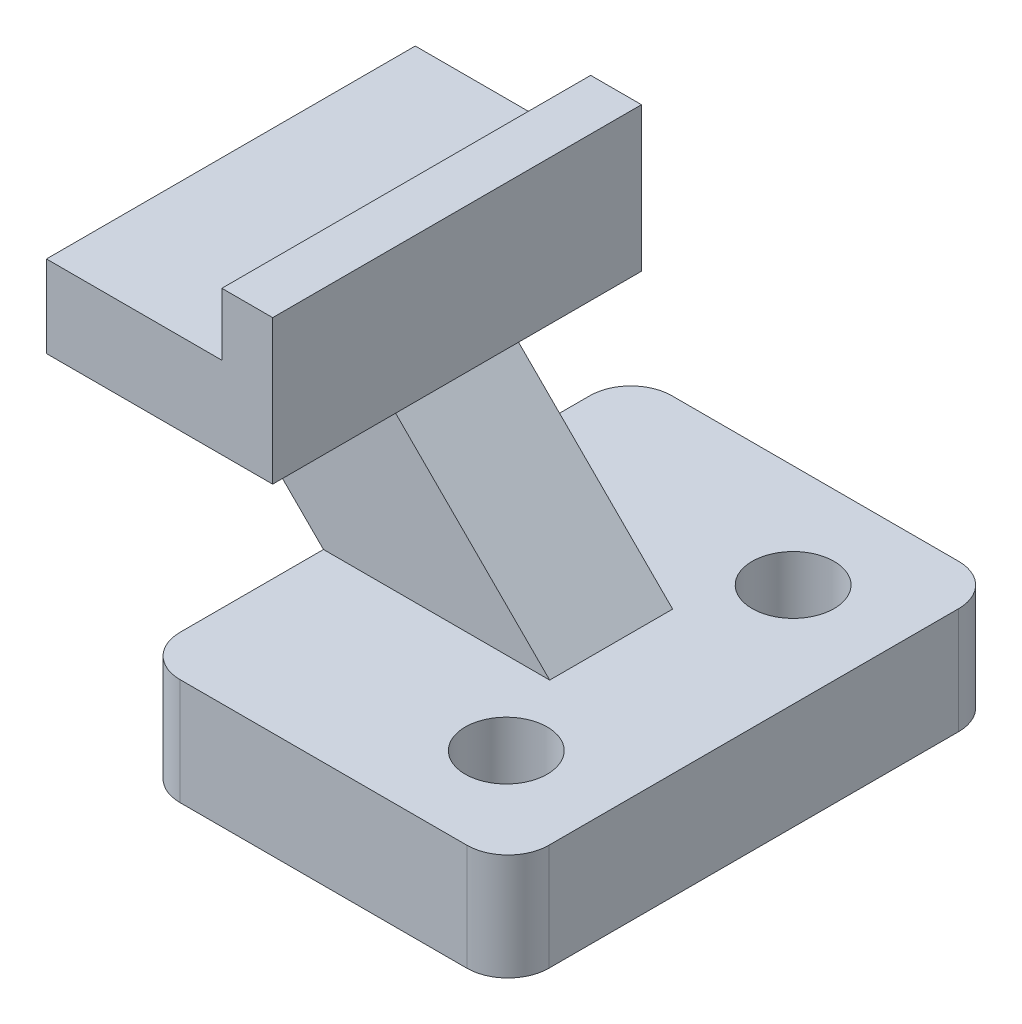
ISO-10303-21;
HEADER;
FILE_DESCRIPTION(('STEP AP214'),'2;1');
FILE_NAME('part.step','',(''),(''),'','','');
FILE_SCHEMA(('AUTOMOTIVE_DESIGN { 1 0 10303 214 1 1 1 1 }'));
ENDSEC;
DATA;
#1=APPLICATION_CONTEXT('core data for automotive mechanical design processes');
#2=APPLICATION_PROTOCOL_DEFINITION('international standard','automotive_design',2000,#1);
#3=PRODUCT_CONTEXT('',#1,'mechanical');
#4=PRODUCT('Part','Part','',(#3));
#5=PRODUCT_RELATED_PRODUCT_CATEGORY('part','',(#4));
#6=PRODUCT_DEFINITION_FORMATION('','',#4);
#7=PRODUCT_DEFINITION_CONTEXT('part definition',#1,'design');
#8=PRODUCT_DEFINITION('design','',#6,#7);
#9=PRODUCT_DEFINITION_SHAPE('','',#8);
#10=(LENGTH_UNIT() NAMED_UNIT(*) SI_UNIT(.MILLI.,.METRE.));
#11=(NAMED_UNIT(*) PLANE_ANGLE_UNIT() SI_UNIT($,.RADIAN.));
#12=(NAMED_UNIT(*) SI_UNIT($,.STERADIAN.) SOLID_ANGLE_UNIT());
#13=UNCERTAINTY_MEASURE_WITH_UNIT(LENGTH_MEASURE(1.E-05),#10,'distance_accuracy_value','');
#14=(GEOMETRIC_REPRESENTATION_CONTEXT(3) GLOBAL_UNCERTAINTY_ASSIGNED_CONTEXT((#13)) GLOBAL_UNIT_ASSIGNED_CONTEXT((#10,
#11,#12)) REPRESENTATION_CONTEXT('',''));
#15=CARTESIAN_POINT('',(0.,0.,0.));
#16=DIRECTION('',(0.,0.,1.));
#17=DIRECTION('',(1.,0.,0.));
#18=AXIS2_PLACEMENT_3D('',#15,#16,#17);
#19=CARTESIAN_POINT('',(0.,0.,0.375));
#20=DIRECTION('',(0.,0.,1.));
#21=DIRECTION('',(1.,0.,0.));
#22=AXIS2_PLACEMENT_3D('',#19,#20,#21);
#23=PLANE('',#22);
#24=DIRECTION('',(-0.707106781186551,0.707106781186543,0.));
#25=VECTOR('',#24,1.);
#26=CARTESIAN_POINT('',(-0.685000000000011,1.59,0.375));
#27=LINE('',#26,#25);
#28=CARTESIAN_POINT('',(0.254999999999999,0.65,0.375));
#29=VERTEX_POINT('',#28);
#30=CARTESIAN_POINT('',(-0.685000000000011,1.59,0.375));
#31=VERTEX_POINT('',#30);
#32=EDGE_CURVE('E200',#29,#31,#27,.T.);
#33=ORIENTED_EDGE('',*,*,#32,.T.);
#34=DIRECTION('',(-1.,0.,0.));
#35=VECTOR('',#34,1.);
#36=CARTESIAN_POINT('',(0.,1.59,0.375));
#37=LINE('',#36,#35);
#38=CARTESIAN_POINT('',(-2.06500000000001,1.59,0.375));
#39=VERTEX_POINT('',#38);
#40=EDGE_CURVE('E192',#31,#39,#37,.T.);
#41=ORIENTED_EDGE('',*,*,#40,.T.);
#42=DIRECTION('',(0.707106781186551,-0.707106781186544,0.));
#43=VECTOR('',#42,1.);
#44=CARTESIAN_POINT('',(-1.125,0.65,0.375));
#45=LINE('',#44,#43);
#46=CARTESIAN_POINT('',(-1.125,0.65,0.375));
#47=VERTEX_POINT('',#46);
#48=EDGE_CURVE('E203',#39,#47,#45,.T.);
#49=ORIENTED_EDGE('',*,*,#48,.T.);
#50=DIRECTION('',(1.,0.,0.));
#51=VECTOR('',#50,1.);
#52=CARTESIAN_POINT('',(-1.125,0.65,0.375));
#53=LINE('',#52,#51);
#54=EDGE_CURVE('E60',#47,#29,#53,.T.);
#55=ORIENTED_EDGE('',*,*,#54,.T.);
#56=EDGE_LOOP('',(#33,#41,#49,#55));
#57=FACE_BOUND('',#56,.T.);
#58=ADVANCED_FACE('F39',(#57),#23,.T.);
#59=CARTESIAN_POINT('',(0.,0.,-0.375));
#60=DIRECTION('',(0.,0.,1.));
#61=DIRECTION('',(1.,0.,0.));
#62=AXIS2_PLACEMENT_3D('',#59,#60,#61);
#63=PLANE('',#62);
#64=DIRECTION('',(-1.,0.,0.));
#65=VECTOR('',#64,1.);
#66=CARTESIAN_POINT('',(0.,1.59,-0.375));
#67=LINE('',#66,#65);
#68=CARTESIAN_POINT('',(-0.685000000000011,1.59,-0.375));
#69=VERTEX_POINT('',#68);
#70=CARTESIAN_POINT('',(-2.06500000000001,1.59,-0.375));
#71=VERTEX_POINT('',#70);
#72=EDGE_CURVE('E11',#69,#71,#67,.T.);
#73=ORIENTED_EDGE('',*,*,#72,.F.);
#74=DIRECTION('',(-0.707106781186551,0.707106781186543,0.));
#75=VECTOR('',#74,1.);
#76=CARTESIAN_POINT('',(-0.685000000000011,1.59,-0.375));
#77=LINE('',#76,#75);
#78=CARTESIAN_POINT('',(0.254999999999999,0.65,-0.375));
#79=VERTEX_POINT('',#78);
#80=EDGE_CURVE('E208',#79,#69,#77,.T.);
#81=ORIENTED_EDGE('',*,*,#80,.F.);
#82=DIRECTION('',(1.,0.,0.));
#83=VECTOR('',#82,1.);
#84=CARTESIAN_POINT('',(-1.125,0.65,-0.375));
#85=LINE('',#84,#83);
#86=CARTESIAN_POINT('',(-1.125,0.65,-0.375));
#87=VERTEX_POINT('',#86);
#88=EDGE_CURVE('E54',#87,#79,#85,.T.);
#89=ORIENTED_EDGE('',*,*,#88,.F.);
#90=DIRECTION('',(0.707106781186551,-0.707106781186544,0.));
#91=VECTOR('',#90,1.);
#92=CARTESIAN_POINT('',(-1.125,0.65,-0.375));
#93=LINE('',#92,#91);
#94=EDGE_CURVE('E201',#71,#87,#93,.T.);
#95=ORIENTED_EDGE('',*,*,#94,.F.);
#96=EDGE_LOOP('',(#73,#81,#89,#95));
#97=FACE_BOUND('',#96,.T.);
#98=ADVANCED_FACE('F347',(#97),#63,.F.);
#99=CARTESIAN_POINT('',(-0.875,0.65,1.25));
#100=DIRECTION('',(0.,1.,0.));
#101=DIRECTION('',(0.,0.,1.));
#102=AXIS2_PLACEMENT_3D('',#99,#100,#101);
#103=PLANE('',#102);
#104=CARTESIAN_POINT('',(0.495,0.65,-0.87));
#105=DIRECTION('',(0.,1.,0.));
#106=DIRECTION('',(0.,0.,1.));
#107=AXIS2_PLACEMENT_3D('',#104,#105,#106);
#108=CIRCLE('',#107,0.25);
#109=CARTESIAN_POINT('',(0.495,0.65,-0.62));
#110=VERTEX_POINT('',#109);
#111=EDGE_CURVE('E236',#110,#110,#108,.T.);
#112=ORIENTED_EDGE('',*,*,#111,.F.);
#113=EDGE_LOOP('',(#112));
#114=FACE_BOUND('',#113,.T.);
#115=CARTESIAN_POINT('',(0.495,0.65,0.88));
#116=DIRECTION('',(0.,1.,0.));
#117=DIRECTION('',(0.,0.,1.));
#118=AXIS2_PLACEMENT_3D('',#115,#116,#117);
#119=CIRCLE('',#118,0.25);
#120=CARTESIAN_POINT('',(0.495,0.65,1.13));
#121=VERTEX_POINT('',#120);
#122=EDGE_CURVE('E230',#121,#121,#119,.T.);
#123=ORIENTED_EDGE('',*,*,#122,.F.);
#124=EDGE_LOOP('',(#123));
#125=FACE_BOUND('',#124,.T.);
#126=DIRECTION('',(0.,0.,1.));
#127=VECTOR('',#126,1.);
#128=CARTESIAN_POINT('',(-1.125,0.65,-1.25));
#129=LINE('',#128,#127);
#130=CARTESIAN_POINT('',(-1.125,0.65,-1.25));
#131=VERTEX_POINT('',#130);
#132=EDGE_CURVE('E259',#131,#87,#129,.T.);
#133=ORIENTED_EDGE('',*,*,#132,.T.);
#134=ORIENTED_EDGE('',*,*,#88,.T.);
#135=DIRECTION('',(0.,0.,-1.));
#136=VECTOR('',#135,1.);
#137=CARTESIAN_POINT('',(0.254999999999999,0.65,0.375));
#138=LINE('',#137,#136);
#139=EDGE_CURVE('E226',#29,#79,#138,.T.);
#140=ORIENTED_EDGE('',*,*,#139,.F.);
#141=ORIENTED_EDGE('',*,*,#54,.F.);
#142=CARTESIAN_POINT('',(-1.125,0.65,1.25));
#143=VERTEX_POINT('',#142);
#144=EDGE_CURVE('E258',#47,#143,#129,.T.);
#145=ORIENTED_EDGE('',*,*,#144,.T.);
#146=CARTESIAN_POINT('',(-0.875,0.65,1.25));
#147=DIRECTION('',(0.,1.,0.));
#148=DIRECTION('',(0.,0.,1.));
#149=AXIS2_PLACEMENT_3D('',#146,#147,#148);
#150=CIRCLE('',#149,0.25);
#151=CARTESIAN_POINT('',(-0.875,0.65,1.5));
#152=VERTEX_POINT('',#151);
#153=EDGE_CURVE('E242',#143,#152,#150,.T.);
#154=ORIENTED_EDGE('',*,*,#153,.T.);
#155=DIRECTION('',(1.,0.,0.));
#156=VECTOR('',#155,1.);
#157=CARTESIAN_POINT('',(-0.875,0.65,1.5));
#158=LINE('',#157,#156);
#159=CARTESIAN_POINT('',(0.875,0.65,1.5));
#160=VERTEX_POINT('',#159);
#161=EDGE_CURVE('E245',#152,#160,#158,.T.);
#162=ORIENTED_EDGE('',*,*,#161,.T.);
#163=CARTESIAN_POINT('',(0.875,0.65,1.25));
#164=DIRECTION('',(0.,1.,0.));
#165=DIRECTION('',(0.,0.,1.));
#166=AXIS2_PLACEMENT_3D('',#163,#164,#165);
#167=CIRCLE('',#166,0.25);
#168=CARTESIAN_POINT('',(1.125,0.65,1.25));
#169=VERTEX_POINT('',#168);
#170=EDGE_CURVE('E248',#160,#169,#167,.T.);
#171=ORIENTED_EDGE('',*,*,#170,.T.);
#172=DIRECTION('',(0.,0.,-1.));
#173=VECTOR('',#172,1.);
#174=CARTESIAN_POINT('',(1.125,0.65,-1.25));
#175=LINE('',#174,#173);
#176=CARTESIAN_POINT('',(1.125,0.65,-1.25));
#177=VERTEX_POINT('',#176);
#178=EDGE_CURVE('E250',#169,#177,#175,.T.);
#179=ORIENTED_EDGE('',*,*,#178,.T.);
#180=CARTESIAN_POINT('',(0.875,0.65,-1.25));
#181=DIRECTION('',(0.,1.,0.));
#182=DIRECTION('',(0.,0.,1.));
#183=AXIS2_PLACEMENT_3D('',#180,#181,#182);
#184=CIRCLE('',#183,0.25);
#185=CARTESIAN_POINT('',(0.875,0.65,-1.5));
#186=VERTEX_POINT('',#185);
#187=EDGE_CURVE('E252',#177,#186,#184,.T.);
#188=ORIENTED_EDGE('',*,*,#187,.T.);
#189=DIRECTION('',(-1.,0.,0.));
#190=VECTOR('',#189,1.);
#191=CARTESIAN_POINT('',(-0.875,0.65,-1.5));
#192=LINE('',#191,#190);
#193=CARTESIAN_POINT('',(-0.875,0.65,-1.5));
#194=VERTEX_POINT('',#193);
#195=EDGE_CURVE('E254',#186,#194,#192,.T.);
#196=ORIENTED_EDGE('',*,*,#195,.T.);
#197=CARTESIAN_POINT('',(-0.875,0.65,-1.25));
#198=DIRECTION('',(0.,1.,0.));
#199=DIRECTION('',(0.,0.,1.));
#200=AXIS2_PLACEMENT_3D('',#197,#198,#199);
#201=CIRCLE('',#200,0.25);
#202=EDGE_CURVE('E256',#194,#131,#201,.T.);
#203=ORIENTED_EDGE('',*,*,#202,.T.);
#204=EDGE_LOOP('',(#133,#134,#140,#141,#145,#154,#162,#171,#179,#188,#196,#203));
#205=FACE_BOUND('',#204,.T.);
#206=ADVANCED_FACE('F322',(#114,#125,#205),#103,.T.);
#207=CARTESIAN_POINT('',(-0.875,0.,1.25));
#208=DIRECTION('',(0.,1.,0.));
#209=DIRECTION('',(0.,0.,1.));
#210=AXIS2_PLACEMENT_3D('',#207,#208,#209);
#211=PLANE('',#210);
#212=CARTESIAN_POINT('',(-0.875,0.,1.25));
#213=DIRECTION('',(0.,1.,0.));
#214=DIRECTION('',(0.,0.,1.));
#215=AXIS2_PLACEMENT_3D('',#212,#213,#214);
#216=CIRCLE('',#215,0.25);
#217=CARTESIAN_POINT('',(-1.125,0.,1.25));
#218=VERTEX_POINT('',#217);
#219=CARTESIAN_POINT('',(-0.875,0.,1.5));
#220=VERTEX_POINT('',#219);
#221=EDGE_CURVE('E239',#218,#220,#216,.T.);
#222=ORIENTED_EDGE('',*,*,#221,.F.);
#223=DIRECTION('',(0.,0.,1.));
#224=VECTOR('',#223,1.);
#225=CARTESIAN_POINT('',(-1.125,0.,-1.25));
#226=LINE('',#225,#224);
#227=CARTESIAN_POINT('',(-1.125,0.,-1.25));
#228=VERTEX_POINT('',#227);
#229=EDGE_CURVE('E246',#228,#218,#226,.T.);
#230=ORIENTED_EDGE('',*,*,#229,.F.);
#231=CARTESIAN_POINT('',(-0.875,0.,-1.25));
#232=DIRECTION('',(0.,1.,0.));
#233=DIRECTION('',(0.,0.,1.));
#234=AXIS2_PLACEMENT_3D('',#231,#232,#233);
#235=CIRCLE('',#234,0.25);
#236=CARTESIAN_POINT('',(-0.875,0.,-1.5));
#237=VERTEX_POINT('',#236);
#238=EDGE_CURVE('E274',#237,#228,#235,.T.);
#239=ORIENTED_EDGE('',*,*,#238,.F.);
#240=DIRECTION('',(-1.,0.,0.));
#241=VECTOR('',#240,1.);
#242=CARTESIAN_POINT('',(-0.875,0.,-1.5));
#243=LINE('',#242,#241);
#244=CARTESIAN_POINT('',(0.875,0.,-1.5));
#245=VERTEX_POINT('',#244);
#246=EDGE_CURVE('E272',#245,#237,#243,.T.);
#247=ORIENTED_EDGE('',*,*,#246,.F.);
#248=CARTESIAN_POINT('',(0.875,0.,-1.25));
#249=DIRECTION('',(0.,1.,0.));
#250=DIRECTION('',(0.,0.,1.));
#251=AXIS2_PLACEMENT_3D('',#248,#249,#250);
#252=CIRCLE('',#251,0.25);
#253=CARTESIAN_POINT('',(1.125,0.,-1.25));
#254=VERTEX_POINT('',#253);
#255=EDGE_CURVE('E270',#254,#245,#252,.T.);
#256=ORIENTED_EDGE('',*,*,#255,.F.);
#257=DIRECTION('',(0.,0.,-1.));
#258=VECTOR('',#257,1.);
#259=CARTESIAN_POINT('',(1.125,0.,-1.25));
#260=LINE('',#259,#258);
#261=CARTESIAN_POINT('',(1.125,0.,1.25));
#262=VERTEX_POINT('',#261);
#263=EDGE_CURVE('E268',#262,#254,#260,.T.);
#264=ORIENTED_EDGE('',*,*,#263,.F.);
#265=CARTESIAN_POINT('',(0.875,0.,1.25));
#266=DIRECTION('',(0.,1.,0.));
#267=DIRECTION('',(0.,0.,1.));
#268=AXIS2_PLACEMENT_3D('',#265,#266,#267);
#269=CIRCLE('',#268,0.25);
#270=CARTESIAN_POINT('',(0.875,0.,1.5));
#271=VERTEX_POINT('',#270);
#272=EDGE_CURVE('E266',#271,#262,#269,.T.);
#273=ORIENTED_EDGE('',*,*,#272,.F.);
#274=DIRECTION('',(1.,0.,0.));
#275=VECTOR('',#274,1.);
#276=CARTESIAN_POINT('',(-0.875,0.,1.5));
#277=LINE('',#276,#275);
#278=EDGE_CURVE('E264',#220,#271,#277,.T.);
#279=ORIENTED_EDGE('',*,*,#278,.F.);
#280=EDGE_LOOP('',(#222,#230,#239,#247,#256,#264,#273,#279));
#281=FACE_BOUND('',#280,.T.);
#282=CARTESIAN_POINT('',(0.495,0.,-0.87));
#283=DIRECTION('',(0.,1.,0.));
#284=DIRECTION('',(0.,0.,1.));
#285=AXIS2_PLACEMENT_3D('',#282,#283,#284);
#286=CIRCLE('',#285,0.25);
#287=CARTESIAN_POINT('',(0.495,0.,-0.62));
#288=VERTEX_POINT('',#287);
#289=EDGE_CURVE('E233',#288,#288,#286,.T.);
#290=ORIENTED_EDGE('',*,*,#289,.T.);
#291=EDGE_LOOP('',(#290));
#292=FACE_BOUND('',#291,.T.);
#293=CARTESIAN_POINT('',(0.495,0.,0.88));
#294=DIRECTION('',(0.,1.,0.));
#295=DIRECTION('',(0.,0.,1.));
#296=AXIS2_PLACEMENT_3D('',#293,#294,#295);
#297=CIRCLE('',#296,0.25);
#298=CARTESIAN_POINT('',(0.495,0.,1.13));
#299=VERTEX_POINT('',#298);
#300=EDGE_CURVE('E229',#299,#299,#297,.T.);
#301=ORIENTED_EDGE('',*,*,#300,.T.);
#302=EDGE_LOOP('',(#301));
#303=FACE_BOUND('',#302,.T.);
#304=ADVANCED_FACE('F307',(#281,#292,#303),#211,.F.);
#305=CARTESIAN_POINT('',(-0.875,0.65,1.25));
#306=DIRECTION('',(0.,-1.,0.));
#307=DIRECTION('',(0.,0.,-1.));
#308=AXIS2_PLACEMENT_3D('',#305,#306,#307);
#309=CYLINDRICAL_SURFACE('',#308,0.25);
#310=ORIENTED_EDGE('',*,*,#221,.T.);
#311=DIRECTION('',(0.,-1.,0.));
#312=VECTOR('',#311,1.);
#313=CARTESIAN_POINT('',(-0.875,0.65,1.5));
#314=LINE('',#313,#312);
#315=EDGE_CURVE('E47',#152,#220,#314,.T.);
#316=ORIENTED_EDGE('',*,*,#315,.F.);
#317=ORIENTED_EDGE('',*,*,#153,.F.);
#318=DIRECTION('',(0.,-1.,0.));
#319=VECTOR('',#318,1.);
#320=CARTESIAN_POINT('',(-1.125,0.65,1.25));
#321=LINE('',#320,#319);
#322=EDGE_CURVE('E261',#143,#218,#321,.T.);
#323=ORIENTED_EDGE('',*,*,#322,.T.);
#324=EDGE_LOOP('',(#310,#316,#317,#323));
#325=FACE_BOUND('',#324,.T.);
#326=ADVANCED_FACE('F41',(#325),#309,.T.);
#327=CARTESIAN_POINT('',(-0.875,0.65,1.5));
#328=DIRECTION('',(0.,0.,-1.));
#329=DIRECTION('',(-1.,0.,0.));
#330=AXIS2_PLACEMENT_3D('',#327,#328,#329);
#331=PLANE('',#330);
#332=ORIENTED_EDGE('',*,*,#278,.T.);
#333=DIRECTION('',(0.,-1.,0.));
#334=VECTOR('',#333,1.);
#335=CARTESIAN_POINT('',(0.875,0.65,1.5));
#336=LINE('',#335,#334);
#337=EDGE_CURVE('E294',#160,#271,#336,.T.);
#338=ORIENTED_EDGE('',*,*,#337,.F.);
#339=ORIENTED_EDGE('',*,*,#161,.F.);
#340=ORIENTED_EDGE('',*,*,#315,.T.);
#341=EDGE_LOOP('',(#332,#338,#339,#340));
#342=FACE_BOUND('',#341,.T.);
#343=ADVANCED_FACE('F299',(#342),#331,.F.);
#344=CARTESIAN_POINT('',(0.875,0.65,1.25));
#345=DIRECTION('',(0.,-1.,0.));
#346=DIRECTION('',(0.,0.,-1.));
#347=AXIS2_PLACEMENT_3D('',#344,#345,#346);
#348=CYLINDRICAL_SURFACE('',#347,0.25);
#349=ORIENTED_EDGE('',*,*,#272,.T.);
#350=DIRECTION('',(0.,-1.,0.));
#351=VECTOR('',#350,1.);
#352=CARTESIAN_POINT('',(1.125,0.65,1.25));
#353=LINE('',#352,#351);
#354=EDGE_CURVE('E291',#169,#262,#353,.T.);
#355=ORIENTED_EDGE('',*,*,#354,.F.);
#356=ORIENTED_EDGE('',*,*,#170,.F.);
#357=ORIENTED_EDGE('',*,*,#337,.T.);
#358=EDGE_LOOP('',(#349,#355,#356,#357));
#359=FACE_BOUND('',#358,.T.);
#360=ADVANCED_FACE('F315',(#359),#348,.T.);
#361=CARTESIAN_POINT('',(1.125,0.65,-1.25));
#362=DIRECTION('',(-1.,0.,0.));
#363=DIRECTION('',(0.,0.,1.));
#364=AXIS2_PLACEMENT_3D('',#361,#362,#363);
#365=PLANE('',#364);
#366=ORIENTED_EDGE('',*,*,#263,.T.);
#367=DIRECTION('',(0.,-1.,0.));
#368=VECTOR('',#367,1.);
#369=CARTESIAN_POINT('',(1.125,0.65,-1.25));
#370=LINE('',#369,#368);
#371=EDGE_CURVE('E288',#177,#254,#370,.T.);
#372=ORIENTED_EDGE('',*,*,#371,.F.);
#373=ORIENTED_EDGE('',*,*,#178,.F.);
#374=ORIENTED_EDGE('',*,*,#354,.T.);
#375=EDGE_LOOP('',(#366,#372,#373,#374));
#376=FACE_BOUND('',#375,.T.);
#377=ADVANCED_FACE('F319',(#376),#365,.F.);
#378=CARTESIAN_POINT('',(0.875,0.65,-1.25));
#379=DIRECTION('',(0.,-1.,0.));
#380=DIRECTION('',(0.,0.,-1.));
#381=AXIS2_PLACEMENT_3D('',#378,#379,#380);
#382=CYLINDRICAL_SURFACE('',#381,0.25);
#383=ORIENTED_EDGE('',*,*,#255,.T.);
#384=DIRECTION('',(0.,-1.,0.));
#385=VECTOR('',#384,1.);
#386=CARTESIAN_POINT('',(0.875,0.65,-1.5));
#387=LINE('',#386,#385);
#388=EDGE_CURVE('E285',#186,#245,#387,.T.);
#389=ORIENTED_EDGE('',*,*,#388,.F.);
#390=ORIENTED_EDGE('',*,*,#187,.F.);
#391=ORIENTED_EDGE('',*,*,#371,.T.);
#392=EDGE_LOOP('',(#383,#389,#390,#391));
#393=FACE_BOUND('',#392,.T.);
#394=ADVANCED_FACE('F337',(#393),#382,.T.);
#395=CARTESIAN_POINT('',(-0.875,0.65,-1.5));
#396=DIRECTION('',(0.,0.,1.));
#397=DIRECTION('',(1.,0.,0.));
#398=AXIS2_PLACEMENT_3D('',#395,#396,#397);
#399=PLANE('',#398);
#400=ORIENTED_EDGE('',*,*,#246,.T.);
#401=DIRECTION('',(0.,-1.,0.));
#402=VECTOR('',#401,1.);
#403=CARTESIAN_POINT('',(-0.875,0.65,-1.5));
#404=LINE('',#403,#402);
#405=EDGE_CURVE('E282',#194,#237,#404,.T.);
#406=ORIENTED_EDGE('',*,*,#405,.F.);
#407=ORIENTED_EDGE('',*,*,#195,.F.);
#408=ORIENTED_EDGE('',*,*,#388,.T.);
#409=EDGE_LOOP('',(#400,#406,#407,#408));
#410=FACE_BOUND('',#409,.T.);
#411=ADVANCED_FACE('F334',(#410),#399,.F.);
#412=CARTESIAN_POINT('',(-0.875,0.65,-1.25));
#413=DIRECTION('',(0.,-1.,0.));
#414=DIRECTION('',(0.,0.,-1.));
#415=AXIS2_PLACEMENT_3D('',#412,#413,#414);
#416=CYLINDRICAL_SURFACE('',#415,0.25);
#417=ORIENTED_EDGE('',*,*,#238,.T.);
#418=DIRECTION('',(0.,-1.,0.));
#419=VECTOR('',#418,1.);
#420=CARTESIAN_POINT('',(-1.125,0.65,-1.25));
#421=LINE('',#420,#419);
#422=EDGE_CURVE('E279',#131,#228,#421,.T.);
#423=ORIENTED_EDGE('',*,*,#422,.F.);
#424=ORIENTED_EDGE('',*,*,#202,.F.);
#425=ORIENTED_EDGE('',*,*,#405,.T.);
#426=EDGE_LOOP('',(#417,#423,#424,#425));
#427=FACE_BOUND('',#426,.T.);
#428=ADVANCED_FACE('F330',(#427),#416,.T.);
#429=CARTESIAN_POINT('',(-1.125,0.65,-1.25));
#430=DIRECTION('',(1.,0.,0.));
#431=DIRECTION('',(0.,0.,-1.));
#432=AXIS2_PLACEMENT_3D('',#429,#430,#431);
#433=PLANE('',#432);
#434=ORIENTED_EDGE('',*,*,#229,.T.);
#435=ORIENTED_EDGE('',*,*,#322,.F.);
#436=ORIENTED_EDGE('',*,*,#144,.F.);
#437=DIRECTION('',(0.,0.,-1.));
#438=VECTOR('',#437,1.);
#439=CARTESIAN_POINT('',(-1.125,0.65,0.375));
#440=LINE('',#439,#438);
#441=EDGE_CURVE('E206',#47,#87,#440,.T.);
#442=ORIENTED_EDGE('',*,*,#441,.T.);
#443=ORIENTED_EDGE('',*,*,#132,.F.);
#444=ORIENTED_EDGE('',*,*,#422,.T.);
#445=EDGE_LOOP('',(#434,#435,#436,#442,#443,#444));
#446=FACE_BOUND('',#445,.T.);
#447=ADVANCED_FACE('F325',(#446),#433,.F.);
#448=CARTESIAN_POINT('',(0.495,0.65,-0.87));
#449=DIRECTION('',(0.,-1.,0.));
#450=DIRECTION('',(0.,0.,-1.));
#451=AXIS2_PLACEMENT_3D('',#448,#449,#450);
#452=CYLINDRICAL_SURFACE('',#451,0.25);
#453=ORIENTED_EDGE('',*,*,#111,.T.);
#454=EDGE_LOOP('',(#453));
#455=FACE_BOUND('',#454,.T.);
#456=ORIENTED_EDGE('',*,*,#289,.F.);
#457=EDGE_LOOP('',(#456));
#458=FACE_BOUND('',#457,.T.);
#459=ADVANCED_FACE('F388',(#455,#458),#452,.F.);
#460=CARTESIAN_POINT('',(0.495,0.65,0.88));
#461=DIRECTION('',(0.,-1.,0.));
#462=DIRECTION('',(0.,0.,-1.));
#463=AXIS2_PLACEMENT_3D('',#460,#461,#462);
#464=CYLINDRICAL_SURFACE('',#463,0.25);
#465=ORIENTED_EDGE('',*,*,#122,.T.);
#466=EDGE_LOOP('',(#465));
#467=FACE_BOUND('',#466,.T.);
#468=ORIENTED_EDGE('',*,*,#300,.F.);
#469=EDGE_LOOP('',(#468));
#470=FACE_BOUND('',#469,.T.);
#471=ADVANCED_FACE('F384',(#467,#470),#464,.F.);
#472=CARTESIAN_POINT('',(-0.685000000000011,1.59,0.375));
#473=DIRECTION('',(-0.707106781186543,-0.707106781186552,0.));
#474=DIRECTION('',(0.707106781186552,-0.707106781186543,0.));
#475=AXIS2_PLACEMENT_3D('',#472,#473,#474);
#476=PLANE('',#475);
#477=ORIENTED_EDGE('',*,*,#80,.T.);
#478=DIRECTION('',(0.,0.,-1.));
#479=VECTOR('',#478,1.);
#480=CARTESIAN_POINT('',(-0.685000000000011,1.59,0.375));
#481=LINE('',#480,#479);
#482=EDGE_CURVE('E223',#31,#69,#481,.T.);
#483=ORIENTED_EDGE('',*,*,#482,.F.);
#484=ORIENTED_EDGE('',*,*,#32,.F.);
#485=ORIENTED_EDGE('',*,*,#139,.T.);
#486=EDGE_LOOP('',(#477,#483,#484,#485));
#487=FACE_BOUND('',#486,.T.);
#488=ADVANCED_FACE('F380',(#487),#476,.F.);
#489=CARTESIAN_POINT('',(-0.685000000000011,1.59,0.375));
#490=DIRECTION('',(-1.,0.,0.));
#491=DIRECTION('',(0.,0.,1.));
#492=AXIS2_PLACEMENT_3D('',#489,#490,#491);
#493=PLANE('',#492);
#494=ORIENTED_EDGE('',*,*,#482,.T.);
#495=DIRECTION('',(0.,0.,-1.));
#496=VECTOR('',#495,1.);
#497=CARTESIAN_POINT('',(-0.685000000000011,1.59,1.125));
#498=LINE('',#497,#496);
#499=CARTESIAN_POINT('',(-0.685000000000011,1.59,-1.125));
#500=VERTEX_POINT('',#499);
#501=EDGE_CURVE('E625',#69,#500,#498,.T.);
#502=ORIENTED_EDGE('',*,*,#501,.T.);
#503=DIRECTION('',(0.,1.,0.));
#504=VECTOR('',#503,1.);
#505=CARTESIAN_POINT('',(-0.685000000000011,1.59,-1.125));
#506=LINE('',#505,#504);
#507=CARTESIAN_POINT('',(-0.685000000000011,2.47,-1.125));
#508=VERTEX_POINT('',#507);
#509=EDGE_CURVE('E647',#500,#508,#506,.T.);
#510=ORIENTED_EDGE('',*,*,#509,.T.);
#511=DIRECTION('',(0.,0.,-1.));
#512=VECTOR('',#511,1.);
#513=CARTESIAN_POINT('',(-0.685000000000011,2.47,0.375));
#514=LINE('',#513,#512);
#515=CARTESIAN_POINT('',(-0.685000000000011,2.47,1.125));
#516=VERTEX_POINT('',#515);
#517=EDGE_CURVE('E221',#516,#508,#514,.T.);
#518=ORIENTED_EDGE('',*,*,#517,.F.);
#519=DIRECTION('',(0.,1.,0.));
#520=VECTOR('',#519,1.);
#521=CARTESIAN_POINT('',(-0.685000000000011,1.59,1.125));
#522=LINE('',#521,#520);
#523=CARTESIAN_POINT('',(-0.685000000000011,1.59,1.125));
#524=VERTEX_POINT('',#523);
#525=EDGE_CURVE('E174',#524,#516,#522,.T.);
#526=ORIENTED_EDGE('',*,*,#525,.F.);
#527=EDGE_CURVE('E170',#524,#31,#498,.T.);
#528=ORIENTED_EDGE('',*,*,#527,.T.);
#529=EDGE_LOOP('',(#494,#502,#510,#518,#526,#528));
#530=FACE_BOUND('',#529,.T.);
#531=ADVANCED_FACE('F376',(#530),#493,.F.);
#532=CARTESIAN_POINT('',(-0.685000000000011,2.47,0.375));
#533=DIRECTION('',(0.,-1.,0.));
#534=DIRECTION('',(0.,0.,-1.));
#535=AXIS2_PLACEMENT_3D('',#532,#533,#534);
#536=PLANE('',#535);
#537=ORIENTED_EDGE('',*,*,#517,.T.);
#538=DIRECTION('',(-1.,0.,0.));
#539=VECTOR('',#538,1.);
#540=CARTESIAN_POINT('',(-0.685000000000011,2.47,-1.125));
#541=LINE('',#540,#539);
#542=CARTESIAN_POINT('',(-0.995000000000011,2.47,-1.125));
#543=VERTEX_POINT('',#542);
#544=EDGE_CURVE('E649',#508,#543,#541,.T.);
#545=ORIENTED_EDGE('',*,*,#544,.T.);
#546=DIRECTION('',(0.,0.,-1.));
#547=VECTOR('',#546,1.);
#548=CARTESIAN_POINT('',(-0.995000000000011,2.47,0.375));
#549=LINE('',#548,#547);
#550=CARTESIAN_POINT('',(-0.995000000000011,2.47,1.125));
#551=VERTEX_POINT('',#550);
#552=EDGE_CURVE('E219',#551,#543,#549,.T.);
#553=ORIENTED_EDGE('',*,*,#552,.F.);
#554=DIRECTION('',(-1.,0.,0.));
#555=VECTOR('',#554,1.);
#556=CARTESIAN_POINT('',(-0.685000000000011,2.47,1.125));
#557=LINE('',#556,#555);
#558=EDGE_CURVE('E636',#516,#551,#557,.T.);
#559=ORIENTED_EDGE('',*,*,#558,.F.);
#560=EDGE_LOOP('',(#537,#545,#553,#559));
#561=FACE_BOUND('',#560,.T.);
#562=ADVANCED_FACE('F372',(#561),#536,.F.);
#563=CARTESIAN_POINT('',(-0.995000000000011,2.47,0.375));
#564=DIRECTION('',(1.,0.,0.));
#565=DIRECTION('',(0.,0.,-1.));
#566=AXIS2_PLACEMENT_3D('',#563,#564,#565);
#567=PLANE('',#566);
#568=ORIENTED_EDGE('',*,*,#552,.T.);
#569=DIRECTION('',(0.,-1.,0.));
#570=VECTOR('',#569,1.);
#571=CARTESIAN_POINT('',(-0.995000000000011,2.47,-1.125));
#572=LINE('',#571,#570);
#573=CARTESIAN_POINT('',(-0.995000000000011,2.09,-1.125));
#574=VERTEX_POINT('',#573);
#575=EDGE_CURVE('E652',#543,#574,#572,.T.);
#576=ORIENTED_EDGE('',*,*,#575,.T.);
#577=DIRECTION('',(0.,0.,-1.));
#578=VECTOR('',#577,1.);
#579=CARTESIAN_POINT('',(-0.995000000000011,2.09,0.375));
#580=LINE('',#579,#578);
#581=CARTESIAN_POINT('',(-0.995000000000011,2.09,1.125));
#582=VERTEX_POINT('',#581);
#583=EDGE_CURVE('E217',#582,#574,#580,.T.);
#584=ORIENTED_EDGE('',*,*,#583,.F.);
#585=DIRECTION('',(0.,-1.,0.));
#586=VECTOR('',#585,1.);
#587=CARTESIAN_POINT('',(-0.995000000000011,2.47,1.125));
#588=LINE('',#587,#586);
#589=EDGE_CURVE('E638',#551,#582,#588,.T.);
#590=ORIENTED_EDGE('',*,*,#589,.F.);
#591=EDGE_LOOP('',(#568,#576,#584,#590));
#592=FACE_BOUND('',#591,.T.);
#593=ADVANCED_FACE('F368',(#592),#567,.F.);
#594=CARTESIAN_POINT('',(-0.995000000000011,2.09,0.375));
#595=DIRECTION('',(0.,-1.,0.));
#596=DIRECTION('',(1.,0.,0.));
#597=AXIS2_PLACEMENT_3D('',#594,#595,#596);
#598=PLANE('',#597);
#599=ORIENTED_EDGE('',*,*,#583,.T.);
#600=DIRECTION('',(-1.,0.,0.));
#601=VECTOR('',#600,1.);
#602=CARTESIAN_POINT('',(-0.995000000000011,2.09,-1.125));
#603=LINE('',#602,#601);
#604=CARTESIAN_POINT('',(-2.06500000000001,2.09,-1.125));
#605=VERTEX_POINT('',#604);
#606=EDGE_CURVE('E184',#574,#605,#603,.T.);
#607=ORIENTED_EDGE('',*,*,#606,.T.);
#608=DIRECTION('',(0.,0.,-1.));
#609=VECTOR('',#608,1.);
#610=CARTESIAN_POINT('',(-2.06500000000001,2.09,0.375));
#611=LINE('',#610,#609);
#612=CARTESIAN_POINT('',(-2.06500000000001,2.09,1.125));
#613=VERTEX_POINT('',#612);
#614=EDGE_CURVE('E215',#613,#605,#611,.T.);
#615=ORIENTED_EDGE('',*,*,#614,.F.);
#616=DIRECTION('',(-1.,0.,0.));
#617=VECTOR('',#616,1.);
#618=CARTESIAN_POINT('',(-0.995000000000011,2.09,1.125));
#619=LINE('',#618,#617);
#620=EDGE_CURVE('E182',#582,#613,#619,.T.);
#621=ORIENTED_EDGE('',*,*,#620,.F.);
#622=EDGE_LOOP('',(#599,#607,#615,#621));
#623=FACE_BOUND('',#622,.T.);
#624=ADVANCED_FACE('F365',(#623),#598,.F.);
#625=CARTESIAN_POINT('',(-2.06500000000001,2.09,0.375));
#626=DIRECTION('',(1.,0.,0.));
#627=DIRECTION('',(0.,1.,0.));
#628=AXIS2_PLACEMENT_3D('',#625,#626,#627);
#629=PLANE('',#628);
#630=ORIENTED_EDGE('',*,*,#614,.T.);
#631=DIRECTION('',(0.,-1.,0.));
#632=VECTOR('',#631,1.);
#633=CARTESIAN_POINT('',(-2.06500000000001,2.09,-1.125));
#634=LINE('',#633,#632);
#635=CARTESIAN_POINT('',(-2.06500000000001,1.59,-1.125));
#636=VERTEX_POINT('',#635);
#637=EDGE_CURVE('E643',#605,#636,#634,.T.);
#638=ORIENTED_EDGE('',*,*,#637,.T.);
#639=DIRECTION('',(0.,0.,-1.));
#640=VECTOR('',#639,1.);
#641=CARTESIAN_POINT('',(-2.06500000000001,1.59,1.125));
#642=LINE('',#641,#640);
#643=EDGE_CURVE('E193',#71,#636,#642,.T.);
#644=ORIENTED_EDGE('',*,*,#643,.F.);
#645=DIRECTION('',(0.,0.,-1.));
#646=VECTOR('',#645,1.);
#647=CARTESIAN_POINT('',(-2.06500000000001,1.59,0.375));
#648=LINE('',#647,#646);
#649=EDGE_CURVE('E190',#39,#71,#648,.T.);
#650=ORIENTED_EDGE('',*,*,#649,.F.);
#651=CARTESIAN_POINT('',(-2.06500000000001,1.59,1.125));
#652=VERTEX_POINT('',#651);
#653=EDGE_CURVE('E168',#652,#39,#642,.T.);
#654=ORIENTED_EDGE('',*,*,#653,.F.);
#655=DIRECTION('',(0.,-1.,0.));
#656=VECTOR('',#655,1.);
#657=CARTESIAN_POINT('',(-2.06500000000001,2.09,1.125));
#658=LINE('',#657,#656);
#659=EDGE_CURVE('E175',#613,#652,#658,.T.);
#660=ORIENTED_EDGE('',*,*,#659,.F.);
#661=EDGE_LOOP('',(#630,#638,#644,#650,#654,#660));
#662=FACE_BOUND('',#661,.T.);
#663=ADVANCED_FACE('F187',(#662),#629,.F.);
#664=CARTESIAN_POINT('',(-1.125,0.65,0.375));
#665=DIRECTION('',(0.707106781186544,0.707106781186551,0.));
#666=DIRECTION('',(-0.707106781186551,0.707106781186544,0.));
#667=AXIS2_PLACEMENT_3D('',#664,#665,#666);
#668=PLANE('',#667);
#669=ORIENTED_EDGE('',*,*,#94,.T.);
#670=ORIENTED_EDGE('',*,*,#441,.F.);
#671=ORIENTED_EDGE('',*,*,#48,.F.);
#672=ORIENTED_EDGE('',*,*,#649,.T.);
#673=EDGE_LOOP('',(#669,#670,#671,#672));
#674=FACE_BOUND('',#673,.T.);
#675=ADVANCED_FACE('F358',(#674),#668,.F.);
#676=CARTESIAN_POINT('',(0.,0.,-1.125));
#677=DIRECTION('',(0.,0.,1.));
#678=DIRECTION('',(1.,0.,0.));
#679=AXIS2_PLACEMENT_3D('',#676,#677,#678);
#680=PLANE('',#679);
#681=ORIENTED_EDGE('',*,*,#637,.F.);
#682=ORIENTED_EDGE('',*,*,#606,.F.);
#683=ORIENTED_EDGE('',*,*,#575,.F.);
#684=ORIENTED_EDGE('',*,*,#544,.F.);
#685=ORIENTED_EDGE('',*,*,#509,.F.);
#686=DIRECTION('',(1.,0.,0.));
#687=VECTOR('',#686,1.);
#688=CARTESIAN_POINT('',(-2.06500000000001,1.59,-1.125));
#689=LINE('',#688,#687);
#690=EDGE_CURVE('E628',#636,#500,#689,.T.);
#691=ORIENTED_EDGE('',*,*,#690,.F.);
#692=EDGE_LOOP('',(#681,#682,#683,#684,#685,#691));
#693=FACE_BOUND('',#692,.T.);
#694=ADVANCED_FACE('F361',(#693),#680,.F.);
#695=CARTESIAN_POINT('',(-2.06500000000001,1.59,1.125));
#696=DIRECTION('',(0.,1.,0.));
#697=DIRECTION('',(0.,0.,1.));
#698=AXIS2_PLACEMENT_3D('',#695,#696,#697);
#699=PLANE('',#698);
#700=ORIENTED_EDGE('',*,*,#501,.F.);
#701=ORIENTED_EDGE('',*,*,#72,.T.);
#702=ORIENTED_EDGE('',*,*,#643,.T.);
#703=ORIENTED_EDGE('',*,*,#690,.T.);
#704=EDGE_LOOP('',(#700,#701,#702,#703));
#705=FACE_BOUND('',#704,.T.);
#706=ADVANCED_FACE('F453',(#705),#699,.F.);
#707=ORIENTED_EDGE('',*,*,#40,.F.);
#708=ORIENTED_EDGE('',*,*,#527,.F.);
#709=DIRECTION('',(1.,0.,0.));
#710=VECTOR('',#709,1.);
#711=CARTESIAN_POINT('',(-2.06500000000001,1.59,1.125));
#712=LINE('',#711,#710);
#713=EDGE_CURVE('E163',#652,#524,#712,.T.);
#714=ORIENTED_EDGE('',*,*,#713,.F.);
#715=ORIENTED_EDGE('',*,*,#653,.T.);
#716=EDGE_LOOP('',(#707,#708,#714,#715));
#717=FACE_BOUND('',#716,.T.);
#718=ADVANCED_FACE('F166',(#717),#699,.F.);
#719=CARTESIAN_POINT('',(0.,0.,1.125));
#720=DIRECTION('',(0.,0.,1.));
#721=DIRECTION('',(1.,0.,0.));
#722=AXIS2_PLACEMENT_3D('',#719,#720,#721);
#723=PLANE('',#722);
#724=ORIENTED_EDGE('',*,*,#659,.T.);
#725=ORIENTED_EDGE('',*,*,#713,.T.);
#726=ORIENTED_EDGE('',*,*,#525,.T.);
#727=ORIENTED_EDGE('',*,*,#558,.T.);
#728=ORIENTED_EDGE('',*,*,#589,.T.);
#729=ORIENTED_EDGE('',*,*,#620,.T.);
#730=EDGE_LOOP('',(#724,#725,#726,#727,#728,#729));
#731=FACE_BOUND('',#730,.T.);
#732=ADVANCED_FACE('F179',(#731),#723,.T.);
#733=CLOSED_SHELL('',(#58,#98,#206,#304,#326,#343,#360,#377,#394,#411,#428,#447,#459,#471,#488,
#531,#562,#593,#624,#663,#675,#694,#706,#718,#732));
#734=MANIFOLD_SOLID_BREP('B2',#733);
#735=ADVANCED_BREP_SHAPE_REPRESENTATION('',(#18,#734),#14);
#736=SHAPE_DEFINITION_REPRESENTATION(#9,#735);
ENDSEC;
END-ISO-10303-21;
